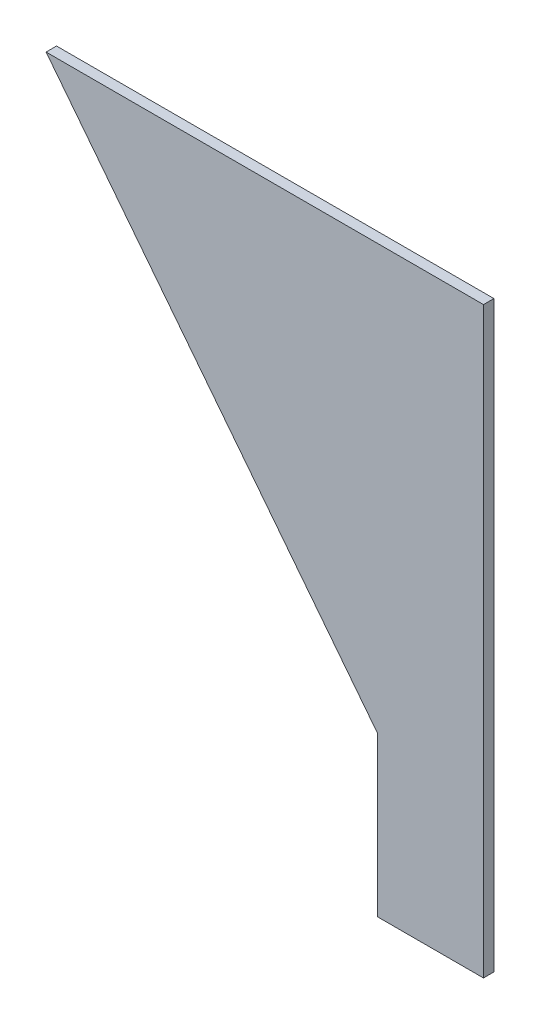
ISO-10303-21;
HEADER;
FILE_DESCRIPTION(('STEP AP214'),'2;1');
FILE_NAME('part.step','',(''),(''),'','','');
FILE_SCHEMA(('AUTOMOTIVE_DESIGN { 1 0 10303 214 1 1 1 1 }'));
ENDSEC;
DATA;
#1=APPLICATION_CONTEXT('core data for automotive mechanical design processes');
#2=APPLICATION_PROTOCOL_DEFINITION('international standard','automotive_design',2000,#1);
#3=PRODUCT_CONTEXT('',#1,'mechanical');
#4=PRODUCT('Part','Part','',(#3));
#5=PRODUCT_RELATED_PRODUCT_CATEGORY('part','',(#4));
#6=PRODUCT_DEFINITION_FORMATION('','',#4);
#7=PRODUCT_DEFINITION_CONTEXT('part definition',#1,'design');
#8=PRODUCT_DEFINITION('design','',#6,#7);
#9=PRODUCT_DEFINITION_SHAPE('','',#8);
#10=(LENGTH_UNIT() NAMED_UNIT(*) SI_UNIT(.MILLI.,.METRE.));
#11=(NAMED_UNIT(*) PLANE_ANGLE_UNIT() SI_UNIT($,.RADIAN.));
#12=(NAMED_UNIT(*) SI_UNIT($,.STERADIAN.) SOLID_ANGLE_UNIT());
#13=UNCERTAINTY_MEASURE_WITH_UNIT(LENGTH_MEASURE(1.E-05),#10,'distance_accuracy_value','');
#14=(GEOMETRIC_REPRESENTATION_CONTEXT(3) GLOBAL_UNCERTAINTY_ASSIGNED_CONTEXT((#13)) GLOBAL_UNIT_ASSIGNED_CONTEXT((#10,
#11,#12)) REPRESENTATION_CONTEXT('',''));
#15=CARTESIAN_POINT('',(0.,0.,0.));
#16=DIRECTION('',(0.,0.,1.));
#17=DIRECTION('',(1.,0.,0.));
#18=AXIS2_PLACEMENT_3D('',#15,#16,#17);
#19=CARTESIAN_POINT('',(-146.05,0.,5.));
#20=DIRECTION('',(1.,0.,0.));
#21=DIRECTION('',(0.,0.,-1.));
#22=AXIS2_PLACEMENT_3D('',#19,#20,#21);
#23=PLANE('',#22);
#24=DIRECTION('',(0.,-1.,0.));
#25=VECTOR('',#24,1.);
#26=CARTESIAN_POINT('',(-146.05,0.,0.));
#27=LINE('',#26,#25);
#28=CARTESIAN_POINT('',(-146.05,0.,0.));
#29=VERTEX_POINT('',#28);
#30=CARTESIAN_POINT('',(-146.05,-76.2,0.));
#31=VERTEX_POINT('',#30);
#32=EDGE_CURVE('E106',#29,#31,#27,.T.);
#33=ORIENTED_EDGE('',*,*,#32,.T.);
#34=DIRECTION('',(0.,0.,-1.));
#35=VECTOR('',#34,1.);
#36=CARTESIAN_POINT('',(-146.05,-76.2,5.));
#37=LINE('',#36,#35);
#38=CARTESIAN_POINT('',(-146.05,-76.2,5.));
#39=VERTEX_POINT('',#38);
#40=EDGE_CURVE('E11',#39,#31,#37,.T.);
#41=ORIENTED_EDGE('',*,*,#40,.F.);
#42=DIRECTION('',(0.,-1.,0.));
#43=VECTOR('',#42,1.);
#44=CARTESIAN_POINT('',(-146.05,0.,5.));
#45=LINE('',#44,#43);
#46=CARTESIAN_POINT('',(-146.05,0.,5.));
#47=VERTEX_POINT('',#46);
#48=EDGE_CURVE('E115',#47,#39,#45,.T.);
#49=ORIENTED_EDGE('',*,*,#48,.F.);
#50=DIRECTION('',(0.,0.,-1.));
#51=VECTOR('',#50,1.);
#52=CARTESIAN_POINT('',(-146.05,0.,5.));
#53=LINE('',#52,#51);
#54=EDGE_CURVE('E102',#47,#29,#53,.T.);
#55=ORIENTED_EDGE('',*,*,#54,.T.);
#56=EDGE_LOOP('',(#33,#41,#49,#55));
#57=FACE_BOUND('',#56,.T.);
#58=ADVANCED_FACE('F33',(#57),#23,.F.);
#59=CARTESIAN_POINT('',(-146.05,-76.2,5.));
#60=DIRECTION('',(0.,1.,0.));
#61=DIRECTION('',(0.,0.,1.));
#62=AXIS2_PLACEMENT_3D('',#59,#60,#61);
#63=PLANE('',#62);
#64=DIRECTION('',(1.,0.,0.));
#65=VECTOR('',#64,1.);
#66=CARTESIAN_POINT('',(-146.05,-76.2,0.));
#67=LINE('',#66,#65);
#68=CARTESIAN_POINT('',(-95.2499999999999,-76.2,0.));
#69=VERTEX_POINT('',#68);
#70=EDGE_CURVE('E109',#31,#69,#67,.T.);
#71=ORIENTED_EDGE('',*,*,#70,.T.);
#72=DIRECTION('',(0.,0.,-1.));
#73=VECTOR('',#72,1.);
#74=CARTESIAN_POINT('',(-95.2499999999999,-76.2,5.));
#75=LINE('',#74,#73);
#76=CARTESIAN_POINT('',(-95.2499999999999,-76.2,5.));
#77=VERTEX_POINT('',#76);
#78=EDGE_CURVE('E41',#77,#69,#75,.T.);
#79=ORIENTED_EDGE('',*,*,#78,.F.);
#80=DIRECTION('',(1.,0.,0.));
#81=VECTOR('',#80,1.);
#82=CARTESIAN_POINT('',(-146.05,-76.2,5.));
#83=LINE('',#82,#81);
#84=EDGE_CURVE('E83',#39,#77,#83,.T.);
#85=ORIENTED_EDGE('',*,*,#84,.F.);
#86=ORIENTED_EDGE('',*,*,#40,.T.);
#87=EDGE_LOOP('',(#71,#79,#85,#86));
#88=FACE_BOUND('',#87,.T.);
#89=ADVANCED_FACE('F117',(#88),#63,.F.);
#90=CARTESIAN_POINT('',(-95.25,203.2,5.));
#91=DIRECTION('',(-1.,0.,0.));
#92=DIRECTION('',(0.,-1.,0.));
#93=AXIS2_PLACEMENT_3D('',#90,#91,#92);
#94=PLANE('',#93);
#95=DIRECTION('',(0.,1.,0.));
#96=VECTOR('',#95,1.);
#97=CARTESIAN_POINT('',(-95.25,203.2,0.));
#98=LINE('',#97,#96);
#99=CARTESIAN_POINT('',(-95.25,203.2,0.));
#100=VERTEX_POINT('',#99);
#101=EDGE_CURVE('E97',#69,#100,#98,.T.);
#102=ORIENTED_EDGE('',*,*,#101,.T.);
#103=DIRECTION('',(0.,0.,-1.));
#104=VECTOR('',#103,1.);
#105=CARTESIAN_POINT('',(-95.25,203.2,5.));
#106=LINE('',#105,#104);
#107=CARTESIAN_POINT('',(-95.25,203.2,5.));
#108=VERTEX_POINT('',#107);
#109=EDGE_CURVE('E95',#108,#100,#106,.T.);
#110=ORIENTED_EDGE('',*,*,#109,.F.);
#111=DIRECTION('',(0.,1.,0.));
#112=VECTOR('',#111,1.);
#113=CARTESIAN_POINT('',(-95.25,0.,5.));
#114=LINE('',#113,#112);
#115=EDGE_CURVE('E87',#77,#108,#114,.T.);
#116=ORIENTED_EDGE('',*,*,#115,.F.);
#117=ORIENTED_EDGE('',*,*,#78,.T.);
#118=EDGE_LOOP('',(#102,#110,#116,#117));
#119=FACE_BOUND('',#118,.T.);
#120=ADVANCED_FACE('F96',(#119),#94,.F.);
#121=CARTESIAN_POINT('',(-304.8,203.2,5.));
#122=DIRECTION('',(0.,-1.,0.));
#123=DIRECTION('',(1.,0.,0.));
#124=AXIS2_PLACEMENT_3D('',#121,#122,#123);
#125=PLANE('',#124);
#126=DIRECTION('',(-1.,0.,0.));
#127=VECTOR('',#126,1.);
#128=CARTESIAN_POINT('',(-304.8,203.2,0.));
#129=LINE('',#128,#127);
#130=CARTESIAN_POINT('',(-304.8,203.2,0.));
#131=VERTEX_POINT('',#130);
#132=EDGE_CURVE('E69',#100,#131,#129,.T.);
#133=ORIENTED_EDGE('',*,*,#132,.T.);
#134=DIRECTION('',(0.,0.,-1.));
#135=VECTOR('',#134,1.);
#136=CARTESIAN_POINT('',(-304.8,203.2,5.));
#137=LINE('',#136,#135);
#138=CARTESIAN_POINT('',(-304.8,203.2,5.));
#139=VERTEX_POINT('',#138);
#140=EDGE_CURVE('E98',#139,#131,#137,.T.);
#141=ORIENTED_EDGE('',*,*,#140,.F.);
#142=DIRECTION('',(-1.,0.,0.));
#143=VECTOR('',#142,1.);
#144=CARTESIAN_POINT('',(-304.8,203.2,5.));
#145=LINE('',#144,#143);
#146=EDGE_CURVE('E91',#108,#139,#145,.T.);
#147=ORIENTED_EDGE('',*,*,#146,.F.);
#148=ORIENTED_EDGE('',*,*,#109,.T.);
#149=EDGE_LOOP('',(#133,#141,#147,#148));
#150=FACE_BOUND('',#149,.T.);
#151=ADVANCED_FACE('F100',(#150),#125,.F.);
#152=CARTESIAN_POINT('',(-146.05,0.,5.));
#153=DIRECTION('',(0.788024373724563,0.615644041972315,0.));
#154=DIRECTION('',(-0.615644041972315,0.788024373724563,0.));
#155=AXIS2_PLACEMENT_3D('',#152,#153,#154);
#156=PLANE('',#155);
#157=DIRECTION('',(0.615644041972315,-0.788024373724563,0.));
#158=VECTOR('',#157,1.);
#159=CARTESIAN_POINT('',(-146.05,0.,0.));
#160=LINE('',#159,#158);
#161=EDGE_CURVE('E75',#131,#29,#160,.T.);
#162=ORIENTED_EDGE('',*,*,#161,.T.);
#163=ORIENTED_EDGE('',*,*,#54,.F.);
#164=DIRECTION('',(0.615644041972315,-0.788024373724563,0.));
#165=VECTOR('',#164,1.);
#166=CARTESIAN_POINT('',(-146.05,0.,5.));
#167=LINE('',#166,#165);
#168=EDGE_CURVE('E49',#139,#47,#167,.T.);
#169=ORIENTED_EDGE('',*,*,#168,.F.);
#170=ORIENTED_EDGE('',*,*,#140,.T.);
#171=EDGE_LOOP('',(#162,#163,#169,#170));
#172=FACE_BOUND('',#171,.T.);
#173=ADVANCED_FACE('F124',(#172),#156,.F.);
#174=CARTESIAN_POINT('',(0.,0.,5.));
#175=DIRECTION('',(0.,0.,1.));
#176=DIRECTION('',(1.,0.,0.));
#177=AXIS2_PLACEMENT_3D('',#174,#175,#176);
#178=PLANE('',#177);
#179=ORIENTED_EDGE('',*,*,#48,.T.);
#180=ORIENTED_EDGE('',*,*,#84,.T.);
#181=ORIENTED_EDGE('',*,*,#115,.T.);
#182=ORIENTED_EDGE('',*,*,#146,.T.);
#183=ORIENTED_EDGE('',*,*,#168,.T.);
#184=EDGE_LOOP('',(#179,#180,#181,#182,#183));
#185=FACE_BOUND('',#184,.T.);
#186=ADVANCED_FACE('F89',(#185),#178,.T.);
#187=CARTESIAN_POINT('',(0.,0.,0.));
#188=DIRECTION('',(0.,0.,1.));
#189=DIRECTION('',(1.,0.,0.));
#190=AXIS2_PLACEMENT_3D('',#187,#188,#189);
#191=PLANE('',#190);
#192=ORIENTED_EDGE('',*,*,#32,.F.);
#193=ORIENTED_EDGE('',*,*,#161,.F.);
#194=ORIENTED_EDGE('',*,*,#132,.F.);
#195=ORIENTED_EDGE('',*,*,#101,.F.);
#196=ORIENTED_EDGE('',*,*,#70,.F.);
#197=EDGE_LOOP('',(#192,#193,#194,#195,#196));
#198=FACE_BOUND('',#197,.T.);
#199=ADVANCED_FACE('F121',(#198),#191,.F.);
#200=CLOSED_SHELL('',(#58,#89,#120,#151,#173,#186,#199));
#201=MANIFOLD_SOLID_BREP('B2',#200);
#202=ADVANCED_BREP_SHAPE_REPRESENTATION('',(#18,#201),#14);
#203=SHAPE_DEFINITION_REPRESENTATION(#9,#202);
ENDSEC;
END-ISO-10303-21;
